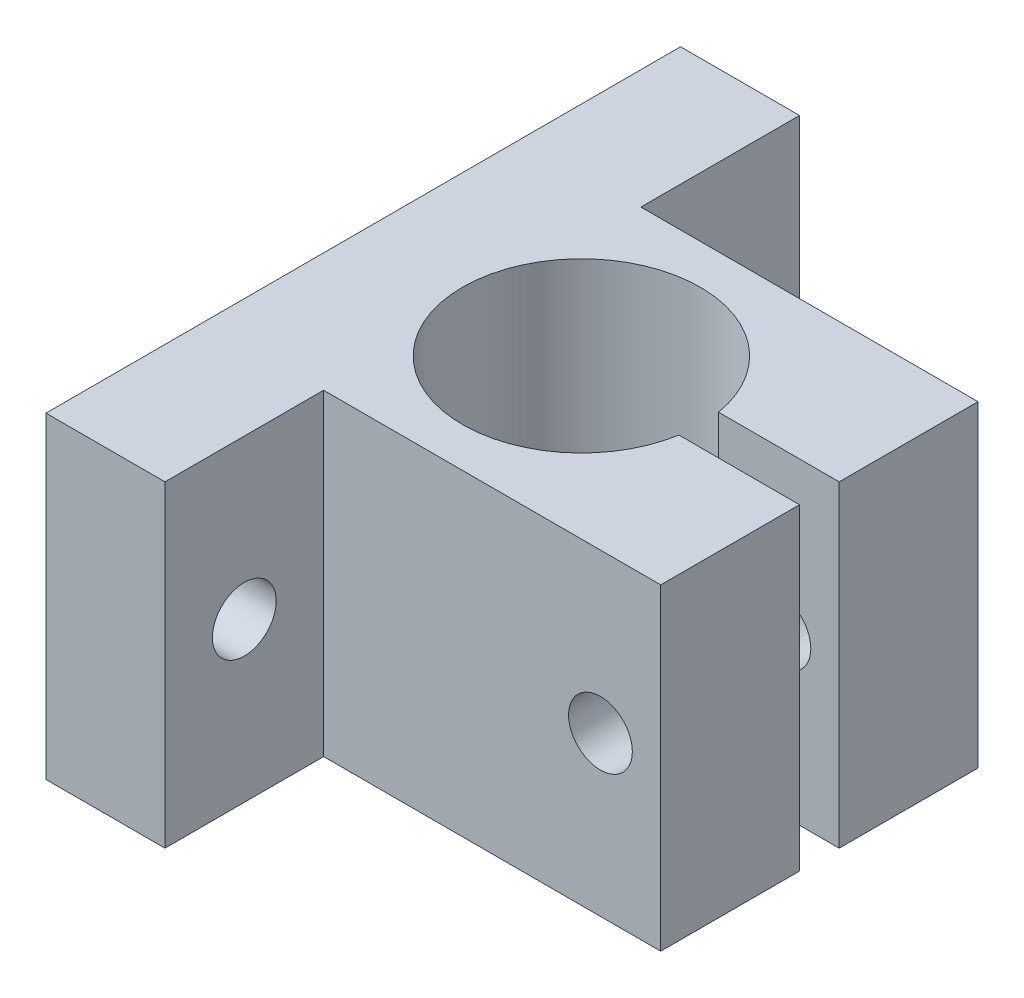
ISO-10303-21;
HEADER;
FILE_DESCRIPTION(('STEP AP214'),'2;1');
FILE_NAME('part.step','',(''),(''),'','','');
FILE_SCHEMA(('AUTOMOTIVE_DESIGN { 1 0 10303 214 1 1 1 1 }'));
ENDSEC;
DATA;
#1=APPLICATION_CONTEXT('core data for automotive mechanical design processes');
#2=APPLICATION_PROTOCOL_DEFINITION('international standard','automotive_design',2000,#1);
#3=PRODUCT_CONTEXT('',#1,'mechanical');
#4=PRODUCT('Part','Part','',(#3));
#5=PRODUCT_RELATED_PRODUCT_CATEGORY('part','',(#4));
#6=PRODUCT_DEFINITION_FORMATION('','',#4);
#7=PRODUCT_DEFINITION_CONTEXT('part definition',#1,'design');
#8=PRODUCT_DEFINITION('design','',#6,#7);
#9=PRODUCT_DEFINITION_SHAPE('','',#8);
#10=(LENGTH_UNIT() NAMED_UNIT(*) SI_UNIT(.MILLI.,.METRE.));
#11=(NAMED_UNIT(*) PLANE_ANGLE_UNIT() SI_UNIT($,.RADIAN.));
#12=(NAMED_UNIT(*) SI_UNIT($,.STERADIAN.) SOLID_ANGLE_UNIT());
#13=UNCERTAINTY_MEASURE_WITH_UNIT(LENGTH_MEASURE(1.E-05),#10,'distance_accuracy_value','');
#14=(GEOMETRIC_REPRESENTATION_CONTEXT(3) GLOBAL_UNCERTAINTY_ASSIGNED_CONTEXT((#13)) GLOBAL_UNIT_ASSIGNED_CONTEXT((#10,
#11,#12)) REPRESENTATION_CONTEXT('',''));
#15=CARTESIAN_POINT('',(0.,0.,0.));
#16=DIRECTION('',(0.,0.,1.));
#17=DIRECTION('',(1.,0.,0.));
#18=AXIS2_PLACEMENT_3D('',#15,#16,#17);
#19=CARTESIAN_POINT('',(11.1125,-12.7,-25.4));
#20=DIRECTION('',(-1.,0.,0.));
#21=DIRECTION('',(0.,0.,1.));
#22=AXIS2_PLACEMENT_3D('',#19,#20,#21);
#23=PLANE('',#22);
#24=DIRECTION('',(0.,0.,1.));
#25=VECTOR('',#24,1.);
#26=CARTESIAN_POINT('',(11.1125,-12.7,-25.4));
#27=LINE('',#26,#25);
#28=CARTESIAN_POINT('',(11.1125,-12.7,1.5875));
#29=VERTEX_POINT('',#28);
#30=CARTESIAN_POINT('',(11.1125,-12.7,12.7));
#31=VERTEX_POINT('',#30);
#32=EDGE_CURVE('E143',#29,#31,#27,.T.);
#33=ORIENTED_EDGE('',*,*,#32,.F.);
#34=DIRECTION('',(0.,1.,0.));
#35=VECTOR('',#34,1.);
#36=CARTESIAN_POINT('',(11.1125,-12.7,1.5875));
#37=LINE('',#36,#35);
#38=CARTESIAN_POINT('',(11.1125,12.7,1.5875));
#39=VERTEX_POINT('',#38);
#40=EDGE_CURVE('E11',#29,#39,#37,.T.);
#41=ORIENTED_EDGE('',*,*,#40,.T.);
#42=DIRECTION('',(0.,0.,1.));
#43=VECTOR('',#42,1.);
#44=CARTESIAN_POINT('',(11.1125,12.7,-25.4));
#45=LINE('',#44,#43);
#46=CARTESIAN_POINT('',(11.1125,12.7,12.7));
#47=VERTEX_POINT('',#46);
#48=EDGE_CURVE('E144',#39,#47,#45,.T.);
#49=ORIENTED_EDGE('',*,*,#48,.T.);
#50=DIRECTION('',(0.,1.,0.));
#51=VECTOR('',#50,1.);
#52=CARTESIAN_POINT('',(11.1125,-12.7,12.7));
#53=LINE('',#52,#51);
#54=EDGE_CURVE('E217',#31,#47,#53,.T.);
#55=ORIENTED_EDGE('',*,*,#54,.F.);
#56=EDGE_LOOP('',(#33,#41,#49,#55));
#57=FACE_BOUND('',#56,.T.);
#58=ADVANCED_FACE('F34',(#57),#23,.F.);
#59=CARTESIAN_POINT('',(-25.4,12.7,-25.4));
#60=DIRECTION('',(0.,0.,1.));
#61=DIRECTION('',(1.,0.,0.));
#62=AXIS2_PLACEMENT_3D('',#59,#60,#61);
#63=PLANE('',#62);
#64=DIRECTION('',(-1.,0.,0.));
#65=VECTOR('',#64,1.);
#66=CARTESIAN_POINT('',(-25.4,12.7,-25.4));
#67=LINE('',#66,#65);
#68=CARTESIAN_POINT('',(-15.875,12.7,-25.4));
#69=VERTEX_POINT('',#68);
#70=CARTESIAN_POINT('',(-25.4,12.7,-25.4));
#71=VERTEX_POINT('',#70);
#72=EDGE_CURVE('E155',#69,#71,#67,.T.);
#73=ORIENTED_EDGE('',*,*,#72,.F.);
#74=DIRECTION('',(0.,1.,0.));
#75=VECTOR('',#74,1.);
#76=CARTESIAN_POINT('',(-15.875,-12.7,-25.4));
#77=LINE('',#76,#75);
#78=CARTESIAN_POINT('',(-15.875,-12.7,-25.4));
#79=VERTEX_POINT('',#78);
#80=EDGE_CURVE('E201',#79,#69,#77,.T.);
#81=ORIENTED_EDGE('',*,*,#80,.F.);
#82=DIRECTION('',(-1.,0.,0.));
#83=VECTOR('',#82,1.);
#84=CARTESIAN_POINT('',(-25.4,-12.7,-25.4));
#85=LINE('',#84,#83);
#86=CARTESIAN_POINT('',(-25.4,-12.7,-25.4));
#87=VERTEX_POINT('',#86);
#88=EDGE_CURVE('E153',#79,#87,#85,.T.);
#89=ORIENTED_EDGE('',*,*,#88,.T.);
#90=DIRECTION('',(0.,-1.,0.));
#91=VECTOR('',#90,1.);
#92=CARTESIAN_POINT('',(-25.4,12.7,-25.4));
#93=LINE('',#92,#91);
#94=EDGE_CURVE('E128',#71,#87,#93,.T.);
#95=ORIENTED_EDGE('',*,*,#94,.F.);
#96=EDGE_LOOP('',(#73,#81,#89,#95));
#97=FACE_BOUND('',#96,.T.);
#98=ADVANCED_FACE('F36',(#97),#63,.F.);
#99=CARTESIAN_POINT('',(-25.4,12.7,-25.4));
#100=DIRECTION('',(1.,0.,0.));
#101=DIRECTION('',(0.,0.,-1.));
#102=AXIS2_PLACEMENT_3D('',#99,#100,#101);
#103=PLANE('',#102);
#104=CARTESIAN_POINT('',(-25.4,0.,19.05));
#105=DIRECTION('',(1.,0.,0.));
#106=DIRECTION('',(0.,0.,-1.));
#107=AXIS2_PLACEMENT_3D('',#104,#105,#106);
#108=CIRCLE('',#107,2.55269999999999);
#109=CARTESIAN_POINT('',(-25.4,0.,16.4973));
#110=VERTEX_POINT('',#109);
#111=EDGE_CURVE('E234',#110,#110,#108,.T.);
#112=ORIENTED_EDGE('',*,*,#111,.T.);
#113=EDGE_LOOP('',(#112));
#114=FACE_BOUND('',#113,.T.);
#115=CARTESIAN_POINT('',(-25.4,0.,-19.05));
#116=DIRECTION('',(1.,0.,0.));
#117=DIRECTION('',(0.,0.,-1.));
#118=AXIS2_PLACEMENT_3D('',#115,#116,#117);
#119=CIRCLE('',#118,2.55269999999999);
#120=CARTESIAN_POINT('',(-25.4,0.,-21.6027));
#121=VERTEX_POINT('',#120);
#122=EDGE_CURVE('E226',#121,#121,#119,.T.);
#123=ORIENTED_EDGE('',*,*,#122,.T.);
#124=EDGE_LOOP('',(#123));
#125=FACE_BOUND('',#124,.T.);
#126=DIRECTION('',(0.,0.,1.));
#127=VECTOR('',#126,1.);
#128=CARTESIAN_POINT('',(-25.4,-12.7,-25.4));
#129=LINE('',#128,#127);
#130=CARTESIAN_POINT('',(-25.4,-12.7,25.4));
#131=VERTEX_POINT('',#130);
#132=EDGE_CURVE('E165',#87,#131,#129,.T.);
#133=ORIENTED_EDGE('',*,*,#132,.T.);
#134=DIRECTION('',(0.,-1.,0.));
#135=VECTOR('',#134,1.);
#136=CARTESIAN_POINT('',(-25.4,12.7,25.4));
#137=LINE('',#136,#135);
#138=CARTESIAN_POINT('',(-25.4,12.7,25.4));
#139=VERTEX_POINT('',#138);
#140=EDGE_CURVE('E163',#139,#131,#137,.T.);
#141=ORIENTED_EDGE('',*,*,#140,.F.);
#142=DIRECTION('',(0.,0.,1.));
#143=VECTOR('',#142,1.);
#144=CARTESIAN_POINT('',(-25.4,12.7,-25.4));
#145=LINE('',#144,#143);
#146=EDGE_CURVE('E157',#71,#139,#145,.T.);
#147=ORIENTED_EDGE('',*,*,#146,.F.);
#148=ORIENTED_EDGE('',*,*,#94,.T.);
#149=EDGE_LOOP('',(#133,#141,#147,#148));
#150=FACE_BOUND('',#149,.T.);
#151=ADVANCED_FACE('F176',(#114,#125,#150),#103,.F.);
#152=CARTESIAN_POINT('',(-25.4,12.7,25.4));
#153=DIRECTION('',(0.,0.,-1.));
#154=DIRECTION('',(-1.,0.,0.));
#155=AXIS2_PLACEMENT_3D('',#152,#153,#154);
#156=PLANE('',#155);
#157=DIRECTION('',(1.,0.,0.));
#158=VECTOR('',#157,1.);
#159=CARTESIAN_POINT('',(-25.4,-12.7,25.4));
#160=LINE('',#159,#158);
#161=CARTESIAN_POINT('',(-15.875,-12.7,25.4));
#162=VERTEX_POINT('',#161);
#163=EDGE_CURVE('E158',#131,#162,#160,.T.);
#164=ORIENTED_EDGE('',*,*,#163,.T.);
#165=DIRECTION('',(0.,1.,0.));
#166=VECTOR('',#165,1.);
#167=CARTESIAN_POINT('',(-15.875,-12.7,25.4));
#168=LINE('',#167,#166);
#169=CARTESIAN_POINT('',(-15.875,12.7,25.4));
#170=VERTEX_POINT('',#169);
#171=EDGE_CURVE('E193',#162,#170,#168,.T.);
#172=ORIENTED_EDGE('',*,*,#171,.T.);
#173=DIRECTION('',(1.,0.,0.));
#174=VECTOR('',#173,1.);
#175=CARTESIAN_POINT('',(-25.4,12.7,25.4));
#176=LINE('',#175,#174);
#177=EDGE_CURVE('E160',#139,#170,#176,.T.);
#178=ORIENTED_EDGE('',*,*,#177,.F.);
#179=ORIENTED_EDGE('',*,*,#140,.T.);
#180=EDGE_LOOP('',(#164,#172,#178,#179));
#181=FACE_BOUND('',#180,.T.);
#182=ADVANCED_FACE('F191',(#181),#156,.F.);
#183=CARTESIAN_POINT('',(0.,12.7,0.));
#184=DIRECTION('',(0.,1.,0.));
#185=DIRECTION('',(0.,0.,1.));
#186=AXIS2_PLACEMENT_3D('',#183,#184,#185);
#187=PLANE('',#186);
#188=DIRECTION('',(1.,0.,0.));
#189=VECTOR('',#188,1.);
#190=CARTESIAN_POINT('',(0.,12.7,1.5875));
#191=LINE('',#190,#189);
#192=CARTESIAN_POINT('',(1.45427665567063,12.7,1.5875));
#193=VERTEX_POINT('',#192);
#194=EDGE_CURVE('E58',#193,#39,#191,.T.);
#195=ORIENTED_EDGE('',*,*,#194,.F.);
#196=CARTESIAN_POINT('',(-7.93750000000001,12.7,0.));
#197=DIRECTION('',(0.,1.,0.));
#198=DIRECTION('',(0.,0.,1.));
#199=AXIS2_PLACEMENT_3D('',#196,#197,#198);
#200=CIRCLE('',#199,9.525);
#201=CARTESIAN_POINT('',(1.45427665567063,12.7,-1.5875));
#202=VERTEX_POINT('',#201);
#203=EDGE_CURVE('E137',#202,#193,#200,.T.);
#204=ORIENTED_EDGE('',*,*,#203,.F.);
#205=DIRECTION('',(-1.,0.,0.));
#206=VECTOR('',#205,1.);
#207=CARTESIAN_POINT('',(0.,12.7,-1.5875));
#208=LINE('',#207,#206);
#209=CARTESIAN_POINT('',(11.1125,12.7,-1.5875));
#210=VERTEX_POINT('',#209);
#211=EDGE_CURVE('E122',#210,#202,#208,.T.);
#212=ORIENTED_EDGE('',*,*,#211,.F.);
#213=CARTESIAN_POINT('',(11.1125,12.7,-12.7));
#214=VERTEX_POINT('',#213);
#215=EDGE_CURVE('E135',#214,#210,#45,.T.);
#216=ORIENTED_EDGE('',*,*,#215,.F.);
#217=DIRECTION('',(1.,0.,0.));
#218=VECTOR('',#217,1.);
#219=CARTESIAN_POINT('',(11.1125,12.7,-12.7));
#220=LINE('',#219,#218);
#221=CARTESIAN_POINT('',(-15.875,12.7,-12.7));
#222=VERTEX_POINT('',#221);
#223=EDGE_CURVE('E211',#222,#214,#220,.T.);
#224=ORIENTED_EDGE('',*,*,#223,.F.);
#225=DIRECTION('',(0.,0.,1.));
#226=VECTOR('',#225,1.);
#227=CARTESIAN_POINT('',(-15.875,12.7,-25.4));
#228=LINE('',#227,#226);
#229=EDGE_CURVE('E199',#69,#222,#228,.T.);
#230=ORIENTED_EDGE('',*,*,#229,.F.);
#231=ORIENTED_EDGE('',*,*,#72,.T.);
#232=ORIENTED_EDGE('',*,*,#146,.T.);
#233=ORIENTED_EDGE('',*,*,#177,.T.);
#234=DIRECTION('',(0.,0.,1.));
#235=VECTOR('',#234,1.);
#236=CARTESIAN_POINT('',(-15.875,12.7,25.4));
#237=LINE('',#236,#235);
#238=CARTESIAN_POINT('',(-15.875,12.7,12.7));
#239=VERTEX_POINT('',#238);
#240=EDGE_CURVE('E196',#239,#170,#237,.T.);
#241=ORIENTED_EDGE('',*,*,#240,.F.);
#242=DIRECTION('',(-1.,0.,0.));
#243=VECTOR('',#242,1.);
#244=CARTESIAN_POINT('',(-15.875,12.7,12.7));
#245=LINE('',#244,#243);
#246=EDGE_CURVE('E222',#47,#239,#245,.T.);
#247=ORIENTED_EDGE('',*,*,#246,.F.);
#248=ORIENTED_EDGE('',*,*,#48,.F.);
#249=EDGE_LOOP('',(#195,#204,#212,#216,#224,#230,#231,#232,#233,#241,#247,#248));
#250=FACE_BOUND('',#249,.T.);
#251=ADVANCED_FACE('F133',(#250),#187,.T.);
#252=CARTESIAN_POINT('',(0.,-12.7,0.));
#253=DIRECTION('',(0.,1.,0.));
#254=DIRECTION('',(0.,0.,1.));
#255=AXIS2_PLACEMENT_3D('',#252,#253,#254);
#256=PLANE('',#255);
#257=CARTESIAN_POINT('',(-7.93750000000001,-12.7,0.));
#258=DIRECTION('',(0.,1.,0.));
#259=DIRECTION('',(0.,0.,1.));
#260=AXIS2_PLACEMENT_3D('',#257,#258,#259);
#261=CIRCLE('',#260,9.525);
#262=CARTESIAN_POINT('',(1.45427665567063,-12.7,-1.5875));
#263=VERTEX_POINT('',#262);
#264=CARTESIAN_POINT('',(1.45427665567063,-12.7,1.5875));
#265=VERTEX_POINT('',#264);
#266=EDGE_CURVE('E150',#263,#265,#261,.T.);
#267=ORIENTED_EDGE('',*,*,#266,.T.);
#268=DIRECTION('',(1.,0.,0.));
#269=VECTOR('',#268,1.);
#270=CARTESIAN_POINT('',(0.,-12.7,1.5875));
#271=LINE('',#270,#269);
#272=EDGE_CURVE('E241',#265,#29,#271,.T.);
#273=ORIENTED_EDGE('',*,*,#272,.T.);
#274=ORIENTED_EDGE('',*,*,#32,.T.);
#275=DIRECTION('',(-1.,0.,0.));
#276=VECTOR('',#275,1.);
#277=CARTESIAN_POINT('',(-15.875,-12.7,12.7));
#278=LINE('',#277,#276);
#279=CARTESIAN_POINT('',(-15.875,-12.7,12.7));
#280=VERTEX_POINT('',#279);
#281=EDGE_CURVE('E218',#31,#280,#278,.T.);
#282=ORIENTED_EDGE('',*,*,#281,.T.);
#283=DIRECTION('',(0.,0.,1.));
#284=VECTOR('',#283,1.);
#285=CARTESIAN_POINT('',(-15.875,-12.7,25.4));
#286=LINE('',#285,#284);
#287=EDGE_CURVE('E188',#280,#162,#286,.T.);
#288=ORIENTED_EDGE('',*,*,#287,.T.);
#289=ORIENTED_EDGE('',*,*,#163,.F.);
#290=ORIENTED_EDGE('',*,*,#132,.F.);
#291=ORIENTED_EDGE('',*,*,#88,.F.);
#292=DIRECTION('',(0.,0.,1.));
#293=VECTOR('',#292,1.);
#294=CARTESIAN_POINT('',(-15.875,-12.7,-25.4));
#295=LINE('',#294,#293);
#296=CARTESIAN_POINT('',(-15.875,-12.7,-12.7));
#297=VERTEX_POINT('',#296);
#298=EDGE_CURVE('E207',#79,#297,#295,.T.);
#299=ORIENTED_EDGE('',*,*,#298,.T.);
#300=DIRECTION('',(1.,0.,0.));
#301=VECTOR('',#300,1.);
#302=CARTESIAN_POINT('',(11.1125,-12.7,-12.7));
#303=LINE('',#302,#301);
#304=CARTESIAN_POINT('',(11.1125,-12.7,-12.7));
#305=VERTEX_POINT('',#304);
#306=EDGE_CURVE('E204',#297,#305,#303,.T.);
#307=ORIENTED_EDGE('',*,*,#306,.T.);
#308=CARTESIAN_POINT('',(11.1125,-12.7,-1.5875));
#309=VERTEX_POINT('',#308);
#310=EDGE_CURVE('E146',#305,#309,#27,.T.);
#311=ORIENTED_EDGE('',*,*,#310,.T.);
#312=DIRECTION('',(-1.,0.,0.));
#313=VECTOR('',#312,1.);
#314=CARTESIAN_POINT('',(0.,-12.7,-1.5875));
#315=LINE('',#314,#313);
#316=EDGE_CURVE('E50',#309,#263,#315,.T.);
#317=ORIENTED_EDGE('',*,*,#316,.T.);
#318=EDGE_LOOP('',(#267,#273,#274,#282,#288,#289,#290,#291,#299,#307,#311,#317));
#319=FACE_BOUND('',#318,.T.);
#320=ADVANCED_FACE('F183',(#319),#256,.F.);
#321=CARTESIAN_POINT('',(-7.93750000000001,-12.7,0.));
#322=DIRECTION('',(0.,1.,0.));
#323=DIRECTION('',(0.,0.,1.));
#324=AXIS2_PLACEMENT_3D('',#321,#322,#323);
#325=CYLINDRICAL_SURFACE('',#324,9.525);
#326=ORIENTED_EDGE('',*,*,#203,.T.);
#327=DIRECTION('',(0.,1.,0.));
#328=VECTOR('',#327,1.);
#329=CARTESIAN_POINT('',(1.45427665567063,-12.7,1.5875));
#330=LINE('',#329,#328);
#331=EDGE_CURVE('E138',#193,#265,#330,.F.);
#332=ORIENTED_EDGE('',*,*,#331,.T.);
#333=ORIENTED_EDGE('',*,*,#266,.F.);
#334=DIRECTION('',(0.,1.,0.));
#335=VECTOR('',#334,1.);
#336=CARTESIAN_POINT('',(1.45427665567063,-12.7,-1.5875));
#337=LINE('',#336,#335);
#338=EDGE_CURVE('E247',#263,#202,#337,.T.);
#339=ORIENTED_EDGE('',*,*,#338,.T.);
#340=EDGE_LOOP('',(#326,#332,#333,#339));
#341=FACE_BOUND('',#340,.T.);
#342=ADVANCED_FACE('F286',(#341),#325,.F.);
#343=ORIENTED_EDGE('',*,*,#215,.T.);
#344=DIRECTION('',(0.,-1.,0.));
#345=VECTOR('',#344,1.);
#346=CARTESIAN_POINT('',(11.1125,-12.7,-1.5875));
#347=LINE('',#346,#345);
#348=EDGE_CURVE('E43',#210,#309,#347,.T.);
#349=ORIENTED_EDGE('',*,*,#348,.T.);
#350=ORIENTED_EDGE('',*,*,#310,.F.);
#351=DIRECTION('',(0.,1.,0.));
#352=VECTOR('',#351,1.);
#353=CARTESIAN_POINT('',(11.1125,-12.7,-12.7));
#354=LINE('',#353,#352);
#355=EDGE_CURVE('E142',#305,#214,#354,.T.);
#356=ORIENTED_EDGE('',*,*,#355,.T.);
#357=EDGE_LOOP('',(#343,#349,#350,#356));
#358=FACE_BOUND('',#357,.T.);
#359=ADVANCED_FACE('F141',(#358),#23,.F.);
#360=CARTESIAN_POINT('',(11.1125,-12.7,-12.7));
#361=DIRECTION('',(0.,0.,1.));
#362=DIRECTION('',(1.,0.,0.));
#363=AXIS2_PLACEMENT_3D('',#360,#361,#362);
#364=PLANE('',#363);
#365=CARTESIAN_POINT('',(6.28649999999999,0.,-12.7));
#366=DIRECTION('',(0.,0.,1.));
#367=DIRECTION('',(1.,0.,0.));
#368=AXIS2_PLACEMENT_3D('',#365,#366,#367);
#369=CIRCLE('',#368,2.55269999999999);
#370=CARTESIAN_POINT('',(8.83919999999998,0.,-12.7));
#371=VERTEX_POINT('',#370);
#372=EDGE_CURVE('E249',#371,#371,#369,.T.);
#373=ORIENTED_EDGE('',*,*,#372,.T.);
#374=EDGE_LOOP('',(#373));
#375=FACE_BOUND('',#374,.T.);
#376=ORIENTED_EDGE('',*,*,#223,.T.);
#377=ORIENTED_EDGE('',*,*,#355,.F.);
#378=ORIENTED_EDGE('',*,*,#306,.F.);
#379=DIRECTION('',(0.,1.,0.));
#380=VECTOR('',#379,1.);
#381=CARTESIAN_POINT('',(-15.875,-12.7,-12.7));
#382=LINE('',#381,#380);
#383=EDGE_CURVE('E203',#297,#222,#382,.T.);
#384=ORIENTED_EDGE('',*,*,#383,.T.);
#385=EDGE_LOOP('',(#376,#377,#378,#384));
#386=FACE_BOUND('',#385,.T.);
#387=ADVANCED_FACE('F285',(#375,#386),#364,.F.);
#388=CARTESIAN_POINT('',(-15.875,-12.7,-25.4));
#389=DIRECTION('',(-1.,0.,0.));
#390=DIRECTION('',(0.,0.,1.));
#391=AXIS2_PLACEMENT_3D('',#388,#389,#390);
#392=PLANE('',#391);
#393=CARTESIAN_POINT('',(-15.875,0.,-19.05));
#394=DIRECTION('',(1.,0.,0.));
#395=DIRECTION('',(0.,0.,-1.));
#396=AXIS2_PLACEMENT_3D('',#393,#394,#395);
#397=CIRCLE('',#396,2.55269999999999);
#398=CARTESIAN_POINT('',(-15.875,0.,-21.6027));
#399=VERTEX_POINT('',#398);
#400=EDGE_CURVE('E231',#399,#399,#397,.T.);
#401=ORIENTED_EDGE('',*,*,#400,.F.);
#402=EDGE_LOOP('',(#401));
#403=FACE_BOUND('',#402,.T.);
#404=ORIENTED_EDGE('',*,*,#229,.T.);
#405=ORIENTED_EDGE('',*,*,#383,.F.);
#406=ORIENTED_EDGE('',*,*,#298,.F.);
#407=ORIENTED_EDGE('',*,*,#80,.T.);
#408=EDGE_LOOP('',(#404,#405,#406,#407));
#409=FACE_BOUND('',#408,.T.);
#410=ADVANCED_FACE('F291',(#403,#409),#392,.F.);
#411=CARTESIAN_POINT('',(-15.875,-12.7,25.4));
#412=DIRECTION('',(-1.,0.,0.));
#413=DIRECTION('',(0.,0.,1.));
#414=AXIS2_PLACEMENT_3D('',#411,#412,#413);
#415=PLANE('',#414);
#416=CARTESIAN_POINT('',(-15.875,0.,19.05));
#417=DIRECTION('',(1.,0.,0.));
#418=DIRECTION('',(0.,0.,-1.));
#419=AXIS2_PLACEMENT_3D('',#416,#417,#418);
#420=CIRCLE('',#419,2.55269999999999);
#421=CARTESIAN_POINT('',(-15.875,0.,16.4973));
#422=VERTEX_POINT('',#421);
#423=EDGE_CURVE('E237',#422,#422,#420,.T.);
#424=ORIENTED_EDGE('',*,*,#423,.F.);
#425=EDGE_LOOP('',(#424));
#426=FACE_BOUND('',#425,.T.);
#427=ORIENTED_EDGE('',*,*,#240,.T.);
#428=ORIENTED_EDGE('',*,*,#171,.F.);
#429=ORIENTED_EDGE('',*,*,#287,.F.);
#430=DIRECTION('',(0.,1.,0.));
#431=VECTOR('',#430,1.);
#432=CARTESIAN_POINT('',(-15.875,-12.7,12.7));
#433=LINE('',#432,#431);
#434=EDGE_CURVE('E213',#280,#239,#433,.T.);
#435=ORIENTED_EDGE('',*,*,#434,.T.);
#436=EDGE_LOOP('',(#427,#428,#429,#435));
#437=FACE_BOUND('',#436,.T.);
#438=ADVANCED_FACE('F320',(#426,#437),#415,.F.);
#439=CARTESIAN_POINT('',(-15.875,-12.7,12.7));
#440=DIRECTION('',(0.,0.,-1.));
#441=DIRECTION('',(-1.,0.,0.));
#442=AXIS2_PLACEMENT_3D('',#439,#440,#441);
#443=PLANE('',#442);
#444=CARTESIAN_POINT('',(6.28649999999999,0.,12.7));
#445=DIRECTION('',(0.,0.,1.));
#446=DIRECTION('',(1.,0.,0.));
#447=AXIS2_PLACEMENT_3D('',#444,#445,#446);
#448=CIRCLE('',#447,2.55269999999999);
#449=CARTESIAN_POINT('',(8.83919999999998,0.,12.7));
#450=VERTEX_POINT('',#449);
#451=EDGE_CURVE('E255',#450,#450,#448,.T.);
#452=ORIENTED_EDGE('',*,*,#451,.F.);
#453=EDGE_LOOP('',(#452));
#454=FACE_BOUND('',#453,.T.);
#455=ORIENTED_EDGE('',*,*,#246,.T.);
#456=ORIENTED_EDGE('',*,*,#434,.F.);
#457=ORIENTED_EDGE('',*,*,#281,.F.);
#458=ORIENTED_EDGE('',*,*,#54,.T.);
#459=EDGE_LOOP('',(#455,#456,#457,#458));
#460=FACE_BOUND('',#459,.T.);
#461=ADVANCED_FACE('F315',(#454,#460),#443,.F.);
#462=CARTESIAN_POINT('',(-15.875,0.,-19.05));
#463=DIRECTION('',(1.,0.,0.));
#464=DIRECTION('',(0.,0.,-1.));
#465=AXIS2_PLACEMENT_3D('',#462,#463,#464);
#466=CYLINDRICAL_SURFACE('',#465,2.55269999999999);
#467=ORIENTED_EDGE('',*,*,#122,.F.);
#468=EDGE_LOOP('',(#467));
#469=FACE_BOUND('',#468,.T.);
#470=ORIENTED_EDGE('',*,*,#400,.T.);
#471=EDGE_LOOP('',(#470));
#472=FACE_BOUND('',#471,.T.);
#473=ADVANCED_FACE('F311',(#469,#472),#466,.F.);
#474=CARTESIAN_POINT('',(-15.875,0.,19.05));
#475=DIRECTION('',(1.,0.,0.));
#476=DIRECTION('',(0.,0.,-1.));
#477=AXIS2_PLACEMENT_3D('',#474,#475,#476);
#478=CYLINDRICAL_SURFACE('',#477,2.55269999999999);
#479=ORIENTED_EDGE('',*,*,#111,.F.);
#480=EDGE_LOOP('',(#479));
#481=FACE_BOUND('',#480,.T.);
#482=ORIENTED_EDGE('',*,*,#423,.T.);
#483=EDGE_LOOP('',(#482));
#484=FACE_BOUND('',#483,.T.);
#485=ADVANCED_FACE('F314',(#481,#484),#478,.F.);
#486=CARTESIAN_POINT('',(-13.0175,18.5450064262227,-1.5875));
#487=DIRECTION('',(0.,0.,-1.));
#488=DIRECTION('',(-1.,0.,0.));
#489=AXIS2_PLACEMENT_3D('',#486,#487,#488);
#490=PLANE('',#489);
#491=CARTESIAN_POINT('',(6.28649999999999,0.,-1.5875));
#492=DIRECTION('',(0.,0.,-1.));
#493=DIRECTION('',(-1.,0.,0.));
#494=AXIS2_PLACEMENT_3D('',#491,#492,#493);
#495=CIRCLE('',#494,2.55269999999999);
#496=CARTESIAN_POINT('',(3.7338,0.,-1.5875));
#497=VERTEX_POINT('',#496);
#498=EDGE_CURVE('E252',#497,#497,#495,.T.);
#499=ORIENTED_EDGE('',*,*,#498,.T.);
#500=EDGE_LOOP('',(#499));
#501=FACE_BOUND('',#500,.T.);
#502=ORIENTED_EDGE('',*,*,#211,.T.);
#503=ORIENTED_EDGE('',*,*,#338,.F.);
#504=ORIENTED_EDGE('',*,*,#316,.F.);
#505=ORIENTED_EDGE('',*,*,#348,.F.);
#506=EDGE_LOOP('',(#502,#503,#504,#505));
#507=FACE_BOUND('',#506,.T.);
#508=ADVANCED_FACE('F121',(#501,#507),#490,.F.);
#509=CARTESIAN_POINT('',(-13.0175,18.5450064262227,1.5875));
#510=DIRECTION('',(0.,0.,1.));
#511=DIRECTION('',(1.,0.,0.));
#512=AXIS2_PLACEMENT_3D('',#509,#510,#511);
#513=PLANE('',#512);
#514=CARTESIAN_POINT('',(6.28649999999999,0.,1.5875));
#515=DIRECTION('',(0.,0.,1.));
#516=DIRECTION('',(1.,0.,0.));
#517=AXIS2_PLACEMENT_3D('',#514,#515,#516);
#518=CIRCLE('',#517,2.55269999999999);
#519=CARTESIAN_POINT('',(8.83919999999998,0.,1.5875));
#520=VERTEX_POINT('',#519);
#521=EDGE_CURVE('E38',#520,#520,#518,.T.);
#522=ORIENTED_EDGE('',*,*,#521,.T.);
#523=EDGE_LOOP('',(#522));
#524=FACE_BOUND('',#523,.T.);
#525=ORIENTED_EDGE('',*,*,#194,.T.);
#526=ORIENTED_EDGE('',*,*,#40,.F.);
#527=ORIENTED_EDGE('',*,*,#272,.F.);
#528=ORIENTED_EDGE('',*,*,#331,.F.);
#529=EDGE_LOOP('',(#525,#526,#527,#528));
#530=FACE_BOUND('',#529,.T.);
#531=ADVANCED_FACE('F262',(#524,#530),#513,.F.);
#532=CARTESIAN_POINT('',(6.28649999999999,0.,12.7));
#533=DIRECTION('',(0.,0.,1.));
#534=DIRECTION('',(1.,0.,0.));
#535=AXIS2_PLACEMENT_3D('',#532,#533,#534);
#536=CYLINDRICAL_SURFACE('',#535,2.55269999999999);
#537=ORIENTED_EDGE('',*,*,#451,.T.);
#538=EDGE_LOOP('',(#537));
#539=FACE_BOUND('',#538,.T.);
#540=ORIENTED_EDGE('',*,*,#521,.F.);
#541=EDGE_LOOP('',(#540));
#542=FACE_BOUND('',#541,.T.);
#543=ADVANCED_FACE('F264',(#539,#542),#536,.F.);
#544=ORIENTED_EDGE('',*,*,#498,.F.);
#545=EDGE_LOOP('',(#544));
#546=FACE_BOUND('',#545,.T.);
#547=ORIENTED_EDGE('',*,*,#372,.F.);
#548=EDGE_LOOP('',(#547));
#549=FACE_BOUND('',#548,.T.);
#550=ADVANCED_FACE('F266',(#546,#549),#536,.F.);
#551=CLOSED_SHELL('',(#58,#98,#151,#182,#251,#320,#342,#359,#387,#410,#438,#461,#473,#485,#508,
#531,#543,#550));
#552=MANIFOLD_SOLID_BREP('B2',#551);
#553=ADVANCED_BREP_SHAPE_REPRESENTATION('',(#18,#552),#14);
#554=SHAPE_DEFINITION_REPRESENTATION(#9,#553);
ENDSEC;
END-ISO-10303-21;
